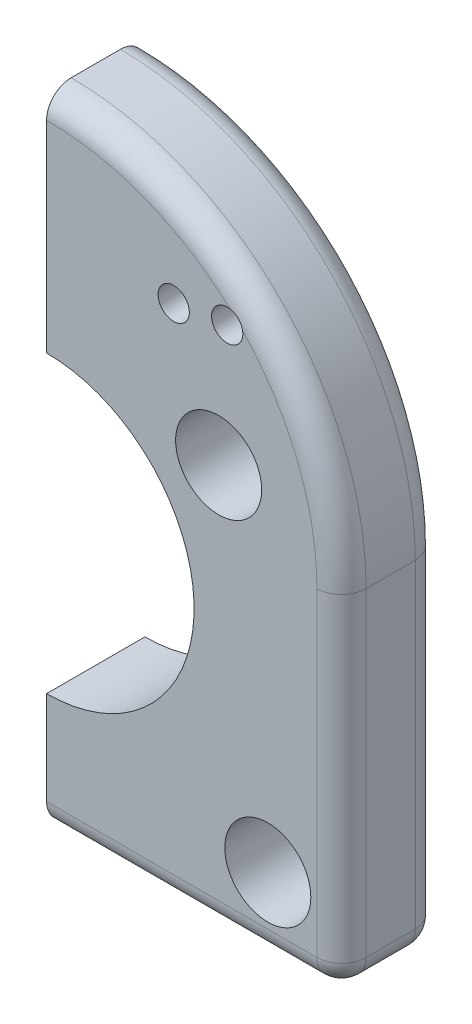
ISO-10303-21;
HEADER;
FILE_DESCRIPTION(('STEP AP214'),'2;1');
FILE_NAME('part.step','',(''),(''),'','','');
FILE_SCHEMA(('AUTOMOTIVE_DESIGN { 1 0 10303 214 1 1 1 1 }'));
ENDSEC;
DATA;
#1=APPLICATION_CONTEXT('core data for automotive mechanical design processes');
#2=APPLICATION_PROTOCOL_DEFINITION('international standard','automotive_design',2000,#1);
#3=PRODUCT_CONTEXT('',#1,'mechanical');
#4=PRODUCT('Part','Part','',(#3));
#5=PRODUCT_RELATED_PRODUCT_CATEGORY('part','',(#4));
#6=PRODUCT_DEFINITION_FORMATION('','',#4);
#7=PRODUCT_DEFINITION_CONTEXT('part definition',#1,'design');
#8=PRODUCT_DEFINITION('design','',#6,#7);
#9=PRODUCT_DEFINITION_SHAPE('','',#8);
#10=(LENGTH_UNIT() NAMED_UNIT(*) SI_UNIT(.MILLI.,.METRE.));
#11=(NAMED_UNIT(*) PLANE_ANGLE_UNIT() SI_UNIT($,.RADIAN.));
#12=(NAMED_UNIT(*) SI_UNIT($,.STERADIAN.) SOLID_ANGLE_UNIT());
#13=UNCERTAINTY_MEASURE_WITH_UNIT(LENGTH_MEASURE(1.E-05),#10,'distance_accuracy_value','');
#14=(GEOMETRIC_REPRESENTATION_CONTEXT(3) GLOBAL_UNCERTAINTY_ASSIGNED_CONTEXT((#13)) GLOBAL_UNIT_ASSIGNED_CONTEXT((#10,
#11,#12)) REPRESENTATION_CONTEXT('',''));
#15=CARTESIAN_POINT('',(0.,0.,0.));
#16=DIRECTION('',(0.,0.,1.));
#17=DIRECTION('',(1.,0.,0.));
#18=AXIS2_PLACEMENT_3D('',#15,#16,#17);
#19=CARTESIAN_POINT('',(-19.05,34.29,12.7));
#20=DIRECTION('',(0.,0.,1.));
#21=DIRECTION('',(1.,0.,0.));
#22=AXIS2_PLACEMENT_3D('',#19,#20,#21);
#23=PLANE('',#22);
#24=CARTESIAN_POINT('',(-2.63081274114402,67.0969348215972,12.7));
#25=DIRECTION('',(0.,0.,1.));
#26=DIRECTION('',(1.,0.,0.));
#27=AXIS2_PLACEMENT_3D('',#24,#25,#26);
#28=CIRCLE('',#27,2.01929999999999);
#29=CARTESIAN_POINT('',(-0.611512741144035,67.0969348215972,12.7));
#30=VERTEX_POINT('',#29);
#31=EDGE_CURVE('E159',#30,#30,#28,.T.);
#32=ORIENTED_EDGE('',*,*,#31,.F.);
#33=EDGE_LOOP('',(#32));
#34=FACE_BOUND('',#33,.T.);
#35=DIRECTION('',(0.,-1.,0.));
#36=VECTOR('',#35,1.);
#37=CARTESIAN_POINT('',(-19.05,0.,12.7));
#38=LINE('',#37,#36);
#39=CARTESIAN_POINT('',(-19.05,15.24,12.7));
#40=VERTEX_POINT('',#39);
#41=CARTESIAN_POINT('',(-19.05,3.175,12.7));
#42=VERTEX_POINT('',#41);
#43=EDGE_CURVE('E184',#40,#42,#38,.T.);
#44=ORIENTED_EDGE('',*,*,#43,.T.);
#45=DIRECTION('',(1.,0.,0.));
#46=VECTOR('',#45,1.);
#47=CARTESIAN_POINT('',(19.05,3.175,12.7));
#48=LINE('',#47,#46);
#49=CARTESIAN_POINT('',(15.875,3.175,12.7));
#50=VERTEX_POINT('',#49);
#51=EDGE_CURVE('E218',#42,#50,#48,.T.);
#52=ORIENTED_EDGE('',*,*,#51,.T.);
#53=DIRECTION('',(0.,1.,0.));
#54=VECTOR('',#53,1.);
#55=CARTESIAN_POINT('',(15.875,44.45,12.7));
#56=LINE('',#55,#54);
#57=CARTESIAN_POINT('',(15.875,44.45,12.7));
#58=VERTEX_POINT('',#57);
#59=EDGE_CURVE('E215',#50,#58,#56,.T.);
#60=ORIENTED_EDGE('',*,*,#59,.T.);
#61=CARTESIAN_POINT('',(-19.05,44.45,12.7));
#62=DIRECTION('',(0.,0.,1.));
#63=DIRECTION('',(1.,0.,0.));
#64=AXIS2_PLACEMENT_3D('',#61,#62,#63);
#65=CIRCLE('',#64,34.925);
#66=CARTESIAN_POINT('',(6.25945275928739,68.5163089406207,12.7));
#67=VERTEX_POINT('',#66);
#68=EDGE_CURVE('E213',#58,#67,#65,.T.);
#69=ORIENTED_EDGE('',*,*,#68,.T.);
#70=CARTESIAN_POINT('',(4.27710903744031,68.1317496364121,12.7));
#71=DIRECTION('',(0.,0.,1.));
#72=DIRECTION('',(1.,0.,0.));
#73=AXIS2_PLACEMENT_3D('',#70,#71,#72);
#74=CIRCLE('',#73,2.01929999999999);
#75=CARTESIAN_POINT('',(4.63171618424718,70.1196697206794,12.7));
#76=VERTEX_POINT('',#75);
#77=EDGE_CURVE('E165',#76,#67,#74,.T.);
#78=ORIENTED_EDGE('',*,*,#77,.F.);
#79=CARTESIAN_POINT('',(-19.05,44.45,12.7));
#80=DIRECTION('',(0.,0.,1.));
#81=DIRECTION('',(1.,0.,0.));
#82=AXIS2_PLACEMENT_3D('',#79,#80,#81);
#83=CIRCLE('',#82,34.925);
#84=CARTESIAN_POINT('',(-19.05,79.375,12.7));
#85=VERTEX_POINT('',#84);
#86=EDGE_CURVE('E211',#76,#85,#83,.T.);
#87=ORIENTED_EDGE('',*,*,#86,.T.);
#88=DIRECTION('',(0.,-1.,0.));
#89=VECTOR('',#88,1.);
#90=CARTESIAN_POINT('',(-19.05,53.34,12.7));
#91=LINE('',#90,#89);
#92=CARTESIAN_POINT('',(-19.05,53.34,12.7));
#93=VERTEX_POINT('',#92);
#94=EDGE_CURVE('E187',#85,#93,#91,.T.);
#95=ORIENTED_EDGE('',*,*,#94,.T.);
#96=CARTESIAN_POINT('',(-19.05,34.29,12.7));
#97=DIRECTION('',(0.,0.,-1.));
#98=DIRECTION('',(1.,0.,0.));
#99=AXIS2_PLACEMENT_3D('',#96,#97,#98);
#100=CIRCLE('',#99,19.05);
#101=EDGE_CURVE('E190',#93,#40,#100,.T.);
#102=ORIENTED_EDGE('',*,*,#101,.T.);
#103=EDGE_LOOP('',(#44,#52,#60,#69,#78,#87,#95,#102));
#104=FACE_BOUND('',#103,.T.);
#105=CARTESIAN_POINT('',(9.525,9.525,12.7));
#106=DIRECTION('',(0.,0.,1.));
#107=DIRECTION('',(1.,0.,0.));
#108=AXIS2_PLACEMENT_3D('',#105,#106,#107);
#109=CIRCLE('',#108,5.55625000000001);
#110=CARTESIAN_POINT('',(15.08125,9.525,12.7));
#111=VERTEX_POINT('',#110);
#112=EDGE_CURVE('E178',#111,#111,#109,.T.);
#113=ORIENTED_EDGE('',*,*,#112,.F.);
#114=EDGE_LOOP('',(#113));
#115=FACE_BOUND('',#114,.T.);
#116=CARTESIAN_POINT('',(3.175,51.9145200049493,12.7));
#117=DIRECTION('',(0.,0.,1.));
#118=DIRECTION('',(1.,0.,0.));
#119=AXIS2_PLACEMENT_3D('',#116,#117,#118);
#120=CIRCLE('',#119,5.55625);
#121=CARTESIAN_POINT('',(8.73125,51.9145200049493,12.7));
#122=VERTEX_POINT('',#121);
#123=EDGE_CURVE('E172',#122,#122,#120,.T.);
#124=ORIENTED_EDGE('',*,*,#123,.F.);
#125=EDGE_LOOP('',(#124));
#126=FACE_BOUND('',#125,.T.);
#127=ADVANCED_FACE('F37',(#34,#104,#115,#126),#23,.T.);
#128=CARTESIAN_POINT('',(-19.05,34.29,0.));
#129=DIRECTION('',(0.,0.,1.));
#130=DIRECTION('',(1.,0.,0.));
#131=AXIS2_PLACEMENT_3D('',#128,#129,#130);
#132=PLANE('',#131);
#133=CARTESIAN_POINT('',(-2.63081274114402,67.0969348215972,0.));
#134=DIRECTION('',(0.,0.,1.));
#135=DIRECTION('',(1.,0.,0.));
#136=AXIS2_PLACEMENT_3D('',#133,#134,#135);
#137=CIRCLE('',#136,2.0193);
#138=CARTESIAN_POINT('',(-0.611512741144027,67.0969348215972,0.));
#139=VERTEX_POINT('',#138);
#140=EDGE_CURVE('E162',#139,#139,#137,.T.);
#141=ORIENTED_EDGE('',*,*,#140,.T.);
#142=EDGE_LOOP('',(#141));
#143=FACE_BOUND('',#142,.T.);
#144=DIRECTION('',(0.,-1.,0.));
#145=VECTOR('',#144,1.);
#146=CARTESIAN_POINT('',(-19.05,53.34,0.));
#147=LINE('',#146,#145);
#148=CARTESIAN_POINT('',(-19.05,79.375,0.));
#149=VERTEX_POINT('',#148);
#150=CARTESIAN_POINT('',(-19.05,53.34,0.));
#151=VERTEX_POINT('',#150);
#152=EDGE_CURVE('E195',#149,#151,#147,.T.);
#153=ORIENTED_EDGE('',*,*,#152,.F.);
#154=CARTESIAN_POINT('',(-19.05,44.45,0.));
#155=DIRECTION('',(0.,0.,1.));
#156=DIRECTION('',(1.,0.,0.));
#157=AXIS2_PLACEMENT_3D('',#154,#155,#156);
#158=CIRCLE('',#157,34.925);
#159=CARTESIAN_POINT('',(4.63171618424717,70.1196697206794,0.));
#160=VERTEX_POINT('',#159);
#161=EDGE_CURVE('E240',#149,#160,#158,.F.);
#162=ORIENTED_EDGE('',*,*,#161,.T.);
#163=CARTESIAN_POINT('',(4.27710903744031,68.1317496364121,0.));
#164=DIRECTION('',(0.,0.,1.));
#165=DIRECTION('',(1.,0.,0.));
#166=AXIS2_PLACEMENT_3D('',#163,#164,#165);
#167=CIRCLE('',#166,2.0193);
#168=CARTESIAN_POINT('',(6.2594527592874,68.5163089406207,0.));
#169=VERTEX_POINT('',#168);
#170=EDGE_CURVE('E168',#160,#169,#167,.T.);
#171=ORIENTED_EDGE('',*,*,#170,.T.);
#172=CARTESIAN_POINT('',(-19.05,44.45,0.));
#173=DIRECTION('',(0.,0.,1.));
#174=DIRECTION('',(1.,0.,0.));
#175=AXIS2_PLACEMENT_3D('',#172,#173,#174);
#176=CIRCLE('',#175,34.925);
#177=CARTESIAN_POINT('',(15.875,44.45,0.));
#178=VERTEX_POINT('',#177);
#179=EDGE_CURVE('E238',#169,#178,#176,.F.);
#180=ORIENTED_EDGE('',*,*,#179,.T.);
#181=DIRECTION('',(0.,1.,0.));
#182=VECTOR('',#181,1.);
#183=CARTESIAN_POINT('',(15.875,34.29,0.));
#184=LINE('',#183,#182);
#185=CARTESIAN_POINT('',(15.875,3.175,0.));
#186=VERTEX_POINT('',#185);
#187=EDGE_CURVE('E234',#178,#186,#184,.F.);
#188=ORIENTED_EDGE('',*,*,#187,.T.);
#189=DIRECTION('',(1.,0.,0.));
#190=VECTOR('',#189,1.);
#191=CARTESIAN_POINT('',(-19.05,3.175,0.));
#192=LINE('',#191,#190);
#193=CARTESIAN_POINT('',(-19.05,3.175,0.));
#194=VERTEX_POINT('',#193);
#195=EDGE_CURVE('E236',#186,#194,#192,.F.);
#196=ORIENTED_EDGE('',*,*,#195,.T.);
#197=DIRECTION('',(0.,-1.,0.));
#198=VECTOR('',#197,1.);
#199=CARTESIAN_POINT('',(-19.05,0.,0.));
#200=LINE('',#199,#198);
#201=CARTESIAN_POINT('',(-19.05,15.24,0.));
#202=VERTEX_POINT('',#201);
#203=EDGE_CURVE('E181',#202,#194,#200,.T.);
#204=ORIENTED_EDGE('',*,*,#203,.F.);
#205=CARTESIAN_POINT('',(-19.05,34.29,0.));
#206=DIRECTION('',(0.,0.,-1.));
#207=DIRECTION('',(1.,0.,0.));
#208=AXIS2_PLACEMENT_3D('',#205,#206,#207);
#209=CIRCLE('',#208,19.05);
#210=EDGE_CURVE('E188',#151,#202,#209,.T.);
#211=ORIENTED_EDGE('',*,*,#210,.F.);
#212=EDGE_LOOP('',(#153,#162,#171,#180,#188,#196,#204,#211));
#213=FACE_BOUND('',#212,.T.);
#214=CARTESIAN_POINT('',(9.525,9.525,0.));
#215=DIRECTION('',(0.,0.,1.));
#216=DIRECTION('',(1.,0.,0.));
#217=AXIS2_PLACEMENT_3D('',#214,#215,#216);
#218=CIRCLE('',#217,5.55625000000001);
#219=CARTESIAN_POINT('',(15.08125,9.525,0.));
#220=VERTEX_POINT('',#219);
#221=EDGE_CURVE('E175',#220,#220,#218,.T.);
#222=ORIENTED_EDGE('',*,*,#221,.T.);
#223=EDGE_LOOP('',(#222));
#224=FACE_BOUND('',#223,.T.);
#225=CARTESIAN_POINT('',(3.175,51.9145200049493,0.));
#226=DIRECTION('',(0.,0.,1.));
#227=DIRECTION('',(1.,0.,0.));
#228=AXIS2_PLACEMENT_3D('',#225,#226,#227);
#229=CIRCLE('',#228,5.55625);
#230=CARTESIAN_POINT('',(8.73125,51.9145200049493,0.));
#231=VERTEX_POINT('',#230);
#232=EDGE_CURVE('E171',#231,#231,#229,.T.);
#233=ORIENTED_EDGE('',*,*,#232,.T.);
#234=EDGE_LOOP('',(#233));
#235=FACE_BOUND('',#234,.T.);
#236=ADVANCED_FACE('F278',(#143,#213,#224,#235),#132,.F.);
#237=CARTESIAN_POINT('',(-19.05,0.,12.7));
#238=DIRECTION('',(1.,0.,0.));
#239=DIRECTION('',(0.,0.,-1.));
#240=AXIS2_PLACEMENT_3D('',#237,#238,#239);
#241=PLANE('',#240);
#242=CARTESIAN_POINT('',(-19.05,7.62,6.35));
#243=DIRECTION('',(-1.,0.,0.));
#244=DIRECTION('',(0.,0.,1.));
#245=AXIS2_PLACEMENT_3D('',#242,#243,#244);
#246=CIRCLE('',#245,2.01929999999999);
#247=CARTESIAN_POINT('',(-19.05,7.62,8.36929999999999));
#248=VERTEX_POINT('',#247);
#249=EDGE_CURVE('E149',#248,#248,#246,.T.);
#250=ORIENTED_EDGE('',*,*,#249,.F.);
#251=EDGE_LOOP('',(#250));
#252=FACE_BOUND('',#251,.T.);
#253=ORIENTED_EDGE('',*,*,#203,.T.);
#254=CARTESIAN_POINT('',(-19.05,3.175,3.175));
#255=DIRECTION('',(1.,0.,0.));
#256=DIRECTION('',(0.,0.,-1.));
#257=AXIS2_PLACEMENT_3D('',#254,#255,#256);
#258=CIRCLE('',#257,3.175);
#259=CARTESIAN_POINT('',(-19.05,0.,3.175));
#260=VERTEX_POINT('',#259);
#261=EDGE_CURVE('E11',#194,#260,#258,.F.);
#262=ORIENTED_EDGE('',*,*,#261,.T.);
#263=DIRECTION('',(0.,0.,-1.));
#264=VECTOR('',#263,1.);
#265=CARTESIAN_POINT('',(-19.05,0.,12.7));
#266=LINE('',#265,#264);
#267=CARTESIAN_POINT('',(-19.05,0.,9.525));
#268=VERTEX_POINT('',#267);
#269=EDGE_CURVE('E209',#268,#260,#266,.T.);
#270=ORIENTED_EDGE('',*,*,#269,.F.);
#271=CARTESIAN_POINT('',(-19.05,3.175,9.525));
#272=DIRECTION('',(1.,0.,0.));
#273=DIRECTION('',(0.,0.,-1.));
#274=AXIS2_PLACEMENT_3D('',#271,#272,#273);
#275=CIRCLE('',#274,3.175);
#276=EDGE_CURVE('E47',#268,#42,#275,.F.);
#277=ORIENTED_EDGE('',*,*,#276,.T.);
#278=ORIENTED_EDGE('',*,*,#43,.F.);
#279=DIRECTION('',(0.,0.,-1.));
#280=VECTOR('',#279,1.);
#281=CARTESIAN_POINT('',(-19.05,15.24,12.7));
#282=LINE('',#281,#280);
#283=EDGE_CURVE('E192',#40,#202,#282,.T.);
#284=ORIENTED_EDGE('',*,*,#283,.T.);
#285=EDGE_LOOP('',(#253,#262,#270,#277,#278,#284));
#286=FACE_BOUND('',#285,.T.);
#287=ADVANCED_FACE('F282',(#252,#286),#241,.F.);
#288=CARTESIAN_POINT('',(-19.05,0.,12.7));
#289=DIRECTION('',(0.,1.,0.));
#290=DIRECTION('',(-1.,0.,0.));
#291=AXIS2_PLACEMENT_3D('',#288,#289,#290);
#292=PLANE('',#291);
#293=ORIENTED_EDGE('',*,*,#269,.T.);
#294=DIRECTION('',(1.,0.,0.));
#295=VECTOR('',#294,1.);
#296=CARTESIAN_POINT('',(-19.05,0.,3.175));
#297=LINE('',#296,#295);
#298=CARTESIAN_POINT('',(15.875,0.,3.175));
#299=VERTEX_POINT('',#298);
#300=EDGE_CURVE('E60',#260,#299,#297,.T.);
#301=ORIENTED_EDGE('',*,*,#300,.T.);
#302=DIRECTION('',(0.,0.,-1.));
#303=VECTOR('',#302,1.);
#304=CARTESIAN_POINT('',(15.875,0.,12.7));
#305=LINE('',#304,#303);
#306=CARTESIAN_POINT('',(15.875,0.,9.525));
#307=VERTEX_POINT('',#306);
#308=EDGE_CURVE('E55',#299,#307,#305,.F.);
#309=ORIENTED_EDGE('',*,*,#308,.T.);
#310=DIRECTION('',(1.,0.,0.));
#311=VECTOR('',#310,1.);
#312=CARTESIAN_POINT('',(-19.05,0.,9.525));
#313=LINE('',#312,#311);
#314=EDGE_CURVE('E371',#307,#268,#313,.F.);
#315=ORIENTED_EDGE('',*,*,#314,.T.);
#316=EDGE_LOOP('',(#293,#301,#309,#315));
#317=FACE_BOUND('',#316,.T.);
#318=ADVANCED_FACE('F298',(#317),#292,.F.);
#319=CARTESIAN_POINT('',(19.05,0.,12.7));
#320=DIRECTION('',(-1.,0.,0.));
#321=DIRECTION('',(0.,-1.,0.));
#322=AXIS2_PLACEMENT_3D('',#319,#320,#321);
#323=PLANE('',#322);
#324=DIRECTION('',(0.,0.,-1.));
#325=VECTOR('',#324,1.);
#326=CARTESIAN_POINT('',(19.05,44.45,12.7));
#327=LINE('',#326,#325);
#328=CARTESIAN_POINT('',(19.05,44.45,9.525));
#329=VERTEX_POINT('',#328);
#330=CARTESIAN_POINT('',(19.05,44.45,3.175));
#331=VERTEX_POINT('',#330);
#332=EDGE_CURVE('E206',#329,#331,#327,.T.);
#333=ORIENTED_EDGE('',*,*,#332,.F.);
#334=DIRECTION('',(0.,1.,0.));
#335=VECTOR('',#334,1.);
#336=CARTESIAN_POINT('',(19.05,0.,9.525));
#337=LINE('',#336,#335);
#338=CARTESIAN_POINT('',(19.05,3.175,9.525));
#339=VERTEX_POINT('',#338);
#340=EDGE_CURVE('E224',#329,#339,#337,.F.);
#341=ORIENTED_EDGE('',*,*,#340,.T.);
#342=DIRECTION('',(0.,0.,-1.));
#343=VECTOR('',#342,1.);
#344=CARTESIAN_POINT('',(19.05,3.175,12.7));
#345=LINE('',#344,#343);
#346=CARTESIAN_POINT('',(19.05,3.175,3.175));
#347=VERTEX_POINT('',#346);
#348=EDGE_CURVE('E222',#339,#347,#345,.T.);
#349=ORIENTED_EDGE('',*,*,#348,.T.);
#350=DIRECTION('',(0.,1.,0.));
#351=VECTOR('',#350,1.);
#352=CARTESIAN_POINT('',(19.05,0.,3.175));
#353=LINE('',#352,#351);
#354=EDGE_CURVE('E220',#347,#331,#353,.T.);
#355=ORIENTED_EDGE('',*,*,#354,.T.);
#356=EDGE_LOOP('',(#333,#341,#349,#355));
#357=FACE_BOUND('',#356,.T.);
#358=ADVANCED_FACE('F294',(#357),#323,.F.);
#359=CARTESIAN_POINT('',(-19.05,44.45,12.7));
#360=DIRECTION('',(0.,0.,-1.));
#361=DIRECTION('',(-1.,0.,0.));
#362=AXIS2_PLACEMENT_3D('',#359,#360,#361);
#363=CYLINDRICAL_SURFACE('',#362,38.1);
#364=ORIENTED_EDGE('',*,*,#332,.T.);
#365=CARTESIAN_POINT('',(-19.05,44.45,3.175));
#366=DIRECTION('',(0.,0.,1.));
#367=DIRECTION('',(1.,0.,0.));
#368=AXIS2_PLACEMENT_3D('',#365,#366,#367);
#369=CIRCLE('',#368,38.1);
#370=CARTESIAN_POINT('',(-19.05,82.55,3.175));
#371=VERTEX_POINT('',#370);
#372=EDGE_CURVE('E228',#331,#371,#369,.T.);
#373=ORIENTED_EDGE('',*,*,#372,.T.);
#374=DIRECTION('',(0.,0.,-1.));
#375=VECTOR('',#374,1.);
#376=CARTESIAN_POINT('',(-19.05,82.55,12.7));
#377=LINE('',#376,#375);
#378=CARTESIAN_POINT('',(-19.05,82.55,9.525));
#379=VERTEX_POINT('',#378);
#380=EDGE_CURVE('E203',#379,#371,#377,.T.);
#381=ORIENTED_EDGE('',*,*,#380,.F.);
#382=CARTESIAN_POINT('',(-19.05,44.45,9.525));
#383=DIRECTION('',(0.,0.,1.));
#384=DIRECTION('',(1.,0.,0.));
#385=AXIS2_PLACEMENT_3D('',#382,#383,#384);
#386=CIRCLE('',#385,38.1);
#387=EDGE_CURVE('E226',#379,#329,#386,.F.);
#388=ORIENTED_EDGE('',*,*,#387,.T.);
#389=EDGE_LOOP('',(#364,#373,#381,#388));
#390=FACE_BOUND('',#389,.T.);
#391=ADVANCED_FACE('F290',(#390),#363,.T.);
#392=CARTESIAN_POINT('',(-19.05,53.34,12.7));
#393=DIRECTION('',(1.,0.,0.));
#394=DIRECTION('',(0.,0.,-1.));
#395=AXIS2_PLACEMENT_3D('',#392,#393,#394);
#396=PLANE('',#395);
#397=CARTESIAN_POINT('',(-19.05,60.96,6.35));
#398=DIRECTION('',(-1.,0.,0.));
#399=DIRECTION('',(0.,0.,1.));
#400=AXIS2_PLACEMENT_3D('',#397,#398,#399);
#401=CIRCLE('',#400,2.01929999999999);
#402=CARTESIAN_POINT('',(-19.05,60.96,8.36929999999999));
#403=VERTEX_POINT('',#402);
#404=EDGE_CURVE('E148',#403,#403,#401,.T.);
#405=ORIENTED_EDGE('',*,*,#404,.F.);
#406=EDGE_LOOP('',(#405));
#407=FACE_BOUND('',#406,.T.);
#408=ORIENTED_EDGE('',*,*,#380,.T.);
#409=CARTESIAN_POINT('',(-19.05,79.375,3.175));
#410=DIRECTION('',(1.,0.,0.));
#411=DIRECTION('',(0.,0.,-1.));
#412=AXIS2_PLACEMENT_3D('',#409,#410,#411);
#413=CIRCLE('',#412,3.175);
#414=EDGE_CURVE('E232',#371,#149,#413,.F.);
#415=ORIENTED_EDGE('',*,*,#414,.T.);
#416=ORIENTED_EDGE('',*,*,#152,.T.);
#417=DIRECTION('',(0.,0.,-1.));
#418=VECTOR('',#417,1.);
#419=CARTESIAN_POINT('',(-19.05,53.34,12.7));
#420=LINE('',#419,#418);
#421=EDGE_CURVE('E200',#93,#151,#420,.T.);
#422=ORIENTED_EDGE('',*,*,#421,.F.);
#423=ORIENTED_EDGE('',*,*,#94,.F.);
#424=CARTESIAN_POINT('',(-19.05,79.375,9.525));
#425=DIRECTION('',(1.,0.,0.));
#426=DIRECTION('',(0.,0.,-1.));
#427=AXIS2_PLACEMENT_3D('',#424,#425,#426);
#428=CIRCLE('',#427,3.175);
#429=EDGE_CURVE('E230',#85,#379,#428,.F.);
#430=ORIENTED_EDGE('',*,*,#429,.T.);
#431=EDGE_LOOP('',(#408,#415,#416,#422,#423,#430));
#432=FACE_BOUND('',#431,.T.);
#433=ADVANCED_FACE('F286',(#407,#432),#396,.F.);
#434=CARTESIAN_POINT('',(-19.05,34.29,12.7));
#435=DIRECTION('',(0.,0.,-1.));
#436=DIRECTION('',(-1.,0.,0.));
#437=AXIS2_PLACEMENT_3D('',#434,#435,#436);
#438=CYLINDRICAL_SURFACE('',#437,19.05);
#439=ORIENTED_EDGE('',*,*,#210,.T.);
#440=ORIENTED_EDGE('',*,*,#283,.F.);
#441=ORIENTED_EDGE('',*,*,#101,.F.);
#442=ORIENTED_EDGE('',*,*,#421,.T.);
#443=EDGE_LOOP('',(#439,#440,#441,#442));
#444=FACE_BOUND('',#443,.T.);
#445=ADVANCED_FACE('F274',(#444),#438,.F.);
#446=CARTESIAN_POINT('',(9.525,9.525,12.7));
#447=DIRECTION('',(0.,0.,-1.));
#448=DIRECTION('',(-1.,0.,0.));
#449=AXIS2_PLACEMENT_3D('',#446,#447,#448);
#450=CYLINDRICAL_SURFACE('',#449,5.55625000000001);
#451=ORIENTED_EDGE('',*,*,#112,.T.);
#452=EDGE_LOOP('',(#451));
#453=FACE_BOUND('',#452,.T.);
#454=ORIENTED_EDGE('',*,*,#221,.F.);
#455=EDGE_LOOP('',(#454));
#456=FACE_BOUND('',#455,.T.);
#457=ADVANCED_FACE('F270',(#453,#456),#450,.F.);
#458=CARTESIAN_POINT('',(3.175,51.9145200049493,12.7));
#459=DIRECTION('',(0.,0.,-1.));
#460=DIRECTION('',(-1.,0.,0.));
#461=AXIS2_PLACEMENT_3D('',#458,#459,#460);
#462=CYLINDRICAL_SURFACE('',#461,5.55625);
#463=ORIENTED_EDGE('',*,*,#123,.T.);
#464=EDGE_LOOP('',(#463));
#465=FACE_BOUND('',#464,.T.);
#466=ORIENTED_EDGE('',*,*,#232,.F.);
#467=EDGE_LOOP('',(#466));
#468=FACE_BOUND('',#467,.T.);
#469=ADVANCED_FACE('F264',(#465,#468),#462,.F.);
#470=CARTESIAN_POINT('',(4.27710903744031,68.1317496364121,12.7));
#471=DIRECTION('',(0.,0.,1.));
#472=DIRECTION('',(1.,0.,0.));
#473=AXIS2_PLACEMENT_3D('',#470,#471,#472);
#474=CYLINDRICAL_SURFACE('',#473,2.01929999999999);
#475=ORIENTED_EDGE('',*,*,#170,.F.);
#476=CARTESIAN_POINT('',(4.63171618424717,70.1196697206794,0.));
#477=CARTESIAN_POINT('',(4.68758846947112,70.1097028806535,3.75708084744664E-06));
#478=CARTESIAN_POINT('',(4.74301002867299,70.0973850975203,0.000440559022219978));
#479=CARTESIAN_POINT('',(4.85260883373584,70.0681360049592,0.00187873139372369));
#480=CARTESIAN_POINT('',(4.90678620908427,70.0512051780112,0.00288004279331596));
#481=CARTESIAN_POINT('',(5.06680778740178,69.9936748033854,0.00627560782444844));
#482=CARTESIAN_POINT('',(5.17029766396141,69.9463093269964,0.00906316925784902));
#483=CARTESIAN_POINT('',(5.36786745678461,69.8348943239468,0.0138276405408528));
#484=CARTESIAN_POINT('',(5.46194429455076,69.7708393635799,0.0158042858344865));
#485=CARTESIAN_POINT('',(5.63803176278236,69.6278483023512,0.0179206778451322));
#486=CARTESIAN_POINT('',(5.72004503821385,69.5489154721839,0.0180608278136659));
#487=CARTESIAN_POINT('',(5.86950094190356,69.3786172989156,0.0164389934416785));
#488=CARTESIAN_POINT('',(5.93697318017117,69.287277850219,0.0146809192220565));
#489=CARTESIAN_POINT('',(6.05565888220445,69.0946168596295,0.0101618891902027));
#490=CARTESIAN_POINT('',(6.10688013035784,68.9933001275254,0.00740141490078933));
#491=CARTESIAN_POINT('',(6.17356105071743,68.8283567967465,0.00363906839490178));
#492=CARTESIAN_POINT('',(6.1949582600873,68.7670698037085,0.00238910195887915));
#493=CARTESIAN_POINT('',(6.23173313878137,68.6428326837103,0.000574014271079536));
#494=CARTESIAN_POINT('',(6.24712210543913,68.579885917987,7.60348928051835E-06));
#495=CARTESIAN_POINT('',(6.2594527592874,68.5163089406207,0.));
#496=B_SPLINE_CURVE_WITH_KNOTS('',3,(#476,#477,#478,#479,#480,#481,#482,#483,#484,#485,#486,
#487,#488,#489,#490,#491,#492,#493,#494,#495),.UNSPECIFIED.,.F.,.F.,(4,2,2,2,2,2,2,2,2,4),(0.,
0.170151715917603,0.340285642434477,0.68008339676474,1.01999191985235,1.3598258057085,
1.69896100646438,2.03793351192316,2.2324406937287,2.4265803605948),.UNSPECIFIED.);
#497=EDGE_CURVE('E249',#160,#169,#496,.T.);
#498=ORIENTED_EDGE('',*,*,#497,.T.);
#499=EDGE_LOOP('',(#475,#498));
#500=FACE_BOUND('',#499,.T.);
#501=ORIENTED_EDGE('',*,*,#77,.T.);
#502=CARTESIAN_POINT('',(6.25945275928739,68.5163089406207,12.7));
#503=CARTESIAN_POINT('',(6.24864408692135,68.5720244928295,12.6999962429192));
#504=CARTESIAN_POINT('',(6.23549153931277,68.6272539007304,12.6995594409778));
#505=CARTESIAN_POINT('',(6.20459221635413,68.7363989387649,12.6981212686063));
#506=CARTESIAN_POINT('',(6.1868459214754,68.7903147056505,12.6971199572067));
#507=CARTESIAN_POINT('',(6.12690778757657,68.9494500871235,12.6937243921756));
#508=CARTESIAN_POINT('',(6.07798631058383,69.05221356309,12.6909368307421));
#509=CARTESIAN_POINT('',(5.96360317703402,69.2480799070598,12.6861723594591));
#510=CARTESIAN_POINT('',(5.89813613383559,69.3411796149355,12.6841957141655));
#511=CARTESIAN_POINT('',(5.75250464826811,69.5150896792531,12.6820793221549));
#512=CARTESIAN_POINT('',(5.67234343631561,69.595902729706,12.6819391721863));
#513=CARTESIAN_POINT('',(5.49980974754842,69.7427722677547,12.6835610065583));
#514=CARTESIAN_POINT('',(5.40746271545328,69.8088587526684,12.6853190807779));
#515=CARTESIAN_POINT('',(5.21303299665863,69.9246241948846,12.6898381108098));
#516=CARTESIAN_POINT('',(5.11095500175453,69.9743110082559,12.6925985850992));
#517=CARTESIAN_POINT('',(4.94502440417094,70.0384957750937,12.6963609316051));
#518=CARTESIAN_POINT('',(4.88342155891223,70.0589658884418,12.6976108980411));
#519=CARTESIAN_POINT('',(4.75864374290119,70.0938621678984,12.6994259857289));
#520=CARTESIAN_POINT('',(4.69547196255589,70.1082996807668,12.6999923965107));
#521=CARTESIAN_POINT('',(4.63171618424719,70.1196697206794,12.7));
#522=B_SPLINE_CURVE_WITH_KNOTS('',3,(#502,#503,#504,#505,#506,#507,#508,#509,#510,#511,#512,
#513,#514,#515,#516,#517,#518,#519,#520,#521),.UNSPECIFIED.,.F.,.F.,(4,2,2,2,2,2,2,2,2,4),(0.,
0.170151715917602,0.340285642434472,0.680083396764737,1.01999191985234,1.35982580570849,
1.69896100646438,2.03793351192318,2.23244069372869,2.42658036059476),.UNSPECIFIED.);
#523=EDGE_CURVE('E242',#67,#76,#522,.T.);
#524=ORIENTED_EDGE('',*,*,#523,.T.);
#525=EDGE_LOOP('',(#501,#524));
#526=FACE_BOUND('',#525,.T.);
#527=ADVANCED_FACE('F258',(#500,#526),#474,.F.);
#528=CARTESIAN_POINT('',(-2.63081274114402,67.0969348215972,12.7));
#529=DIRECTION('',(0.,0.,1.));
#530=DIRECTION('',(1.,0.,0.));
#531=AXIS2_PLACEMENT_3D('',#528,#529,#530);
#532=CYLINDRICAL_SURFACE('',#531,2.01929999999999);
#533=ORIENTED_EDGE('',*,*,#140,.F.);
#534=EDGE_LOOP('',(#533));
#535=FACE_BOUND('',#534,.T.);
#536=ORIENTED_EDGE('',*,*,#31,.T.);
#537=EDGE_LOOP('',(#536));
#538=FACE_BOUND('',#537,.T.);
#539=ADVANCED_FACE('F263',(#535,#538),#532,.F.);
#540=CARTESIAN_POINT('',(-3.048,60.96,6.35));
#541=DIRECTION('',(-1.,0.,0.));
#542=DIRECTION('',(0.,0.,1.));
#543=AXIS2_PLACEMENT_3D('',#540,#541,#542);
#544=CONICAL_SURFACE('',#543,2.0193,1.02974425867665);
#545=CARTESIAN_POINT('',(-1.83468215199765,60.96,6.35));
#546=VERTEX_POINT('',#545);
#547=VERTEX_LOOP('',#546);
#548=FACE_BOUND('',#547,.T.);
#549=CARTESIAN_POINT('',(-3.048,60.96,6.35));
#550=DIRECTION('',(-1.,0.,0.));
#551=DIRECTION('',(0.,0.,1.));
#552=AXIS2_PLACEMENT_3D('',#549,#550,#551);
#553=CIRCLE('',#552,2.0193);
#554=CARTESIAN_POINT('',(-3.048,60.96,8.3693));
#555=VERTEX_POINT('',#554);
#556=EDGE_CURVE('E152',#555,#555,#553,.T.);
#557=ORIENTED_EDGE('',*,*,#556,.T.);
#558=EDGE_LOOP('',(#557));
#559=FACE_BOUND('',#558,.T.);
#560=ADVANCED_FACE('F413',(#548,#559),#544,.F.);
#561=CARTESIAN_POINT('',(-19.05,60.96,6.35));
#562=DIRECTION('',(-1.,0.,0.));
#563=DIRECTION('',(0.,0.,1.));
#564=AXIS2_PLACEMENT_3D('',#561,#562,#563);
#565=CYLINDRICAL_SURFACE('',#564,2.01929999999999);
#566=ORIENTED_EDGE('',*,*,#556,.F.);
#567=EDGE_LOOP('',(#566));
#568=FACE_BOUND('',#567,.T.);
#569=ORIENTED_EDGE('',*,*,#404,.T.);
#570=EDGE_LOOP('',(#569));
#571=FACE_BOUND('',#570,.T.);
#572=ADVANCED_FACE('F142',(#568,#571),#565,.F.);
#573=CARTESIAN_POINT('',(-3.048,7.62,6.35));
#574=DIRECTION('',(-1.,0.,0.));
#575=DIRECTION('',(0.,0.,1.));
#576=AXIS2_PLACEMENT_3D('',#573,#574,#575);
#577=CONICAL_SURFACE('',#576,2.0193,1.02974425867665);
#578=CARTESIAN_POINT('',(-1.83468215199765,7.62,6.35));
#579=VERTEX_POINT('',#578);
#580=VERTEX_LOOP('',#579);
#581=FACE_BOUND('',#580,.T.);
#582=CARTESIAN_POINT('',(-3.048,7.62,6.35));
#583=DIRECTION('',(-1.,0.,0.));
#584=DIRECTION('',(0.,0.,1.));
#585=AXIS2_PLACEMENT_3D('',#582,#583,#584);
#586=CIRCLE('',#585,2.0193);
#587=CARTESIAN_POINT('',(-3.048,7.62,8.3693));
#588=VERTEX_POINT('',#587);
#589=EDGE_CURVE('E146',#588,#588,#586,.T.);
#590=ORIENTED_EDGE('',*,*,#589,.T.);
#591=EDGE_LOOP('',(#590));
#592=FACE_BOUND('',#591,.T.);
#593=ADVANCED_FACE('F138',(#581,#592),#577,.F.);
#594=CARTESIAN_POINT('',(-19.05,7.62,6.35));
#595=DIRECTION('',(-1.,0.,0.));
#596=DIRECTION('',(0.,0.,1.));
#597=AXIS2_PLACEMENT_3D('',#594,#595,#596);
#598=CYLINDRICAL_SURFACE('',#597,2.01929999999999);
#599=ORIENTED_EDGE('',*,*,#589,.F.);
#600=EDGE_LOOP('',(#599));
#601=FACE_BOUND('',#600,.T.);
#602=ORIENTED_EDGE('',*,*,#249,.T.);
#603=EDGE_LOOP('',(#602));
#604=FACE_BOUND('',#603,.T.);
#605=ADVANCED_FACE('F141',(#601,#604),#598,.F.);
#606=CARTESIAN_POINT('',(-19.05,44.45,3.175));
#607=DIRECTION('',(0.,0.,1.));
#608=DIRECTION('',(1.,0.,0.));
#609=AXIS2_PLACEMENT_3D('',#606,#607,#608);
#610=TOROIDAL_SURFACE('',#609,34.925,3.175);
#611=ORIENTED_EDGE('',*,*,#414,.F.);
#612=ORIENTED_EDGE('',*,*,#372,.F.);
#613=CARTESIAN_POINT('',(15.875,44.45,3.175));
#614=DIRECTION('',(0.,-1.,0.));
#615=DIRECTION('',(0.,0.,-1.));
#616=AXIS2_PLACEMENT_3D('',#613,#614,#615);
#617=CIRCLE('',#616,3.175);
#618=EDGE_CURVE('E42',#178,#331,#617,.T.);
#619=ORIENTED_EDGE('',*,*,#618,.F.);
#620=ORIENTED_EDGE('',*,*,#179,.F.);
#621=ORIENTED_EDGE('',*,*,#497,.F.);
#622=ORIENTED_EDGE('',*,*,#161,.F.);
#623=EDGE_LOOP('',(#611,#612,#619,#620,#621,#622));
#624=FACE_BOUND('',#623,.T.);
#625=ADVANCED_FACE('F39',(#624),#610,.T.);
#626=CARTESIAN_POINT('',(15.875,0.,3.175));
#627=DIRECTION('',(0.,1.,0.));
#628=DIRECTION('',(-1.,0.,0.));
#629=AXIS2_PLACEMENT_3D('',#626,#627,#628);
#630=CYLINDRICAL_SURFACE('',#629,3.175);
#631=ORIENTED_EDGE('',*,*,#618,.T.);
#632=ORIENTED_EDGE('',*,*,#354,.F.);
#633=CARTESIAN_POINT('',(15.875,3.175,3.175));
#634=DIRECTION('',(0.,-1.,0.));
#635=DIRECTION('',(1.,0.,0.));
#636=AXIS2_PLACEMENT_3D('',#633,#634,#635);
#637=CIRCLE('',#636,3.175);
#638=EDGE_CURVE('E334',#186,#347,#637,.T.);
#639=ORIENTED_EDGE('',*,*,#638,.F.);
#640=ORIENTED_EDGE('',*,*,#187,.F.);
#641=EDGE_LOOP('',(#631,#632,#639,#640));
#642=FACE_BOUND('',#641,.T.);
#643=ADVANCED_FACE('F344',(#642),#630,.T.);
#644=CARTESIAN_POINT('',(-19.05,3.175,3.175));
#645=DIRECTION('',(1.,0.,0.));
#646=DIRECTION('',(0.,1.,0.));
#647=AXIS2_PLACEMENT_3D('',#644,#645,#646);
#648=CYLINDRICAL_SURFACE('',#647,3.175);
#649=ORIENTED_EDGE('',*,*,#261,.F.);
#650=ORIENTED_EDGE('',*,*,#195,.F.);
#651=CARTESIAN_POINT('',(15.875,3.175,3.175));
#652=DIRECTION('',(1.,0.,0.));
#653=DIRECTION('',(0.,0.,-1.));
#654=AXIS2_PLACEMENT_3D('',#651,#652,#653);
#655=CIRCLE('',#654,3.175);
#656=EDGE_CURVE('E332',#299,#186,#655,.T.);
#657=ORIENTED_EDGE('',*,*,#656,.F.);
#658=ORIENTED_EDGE('',*,*,#300,.F.);
#659=EDGE_LOOP('',(#649,#650,#657,#658));
#660=FACE_BOUND('',#659,.T.);
#661=ADVANCED_FACE('F389',(#660),#648,.T.);
#662=CARTESIAN_POINT('',(15.875,3.175,3.175));
#663=DIRECTION('',(0.,0.,1.));
#664=DIRECTION('',(1.,0.,0.));
#665=AXIS2_PLACEMENT_3D('',#662,#663,#664);
#666=SPHERICAL_SURFACE('',#665,3.175);
#667=ORIENTED_EDGE('',*,*,#656,.T.);
#668=ORIENTED_EDGE('',*,*,#638,.T.);
#669=CARTESIAN_POINT('',(15.875,3.175,3.175));
#670=DIRECTION('',(0.,0.,-1.));
#671=DIRECTION('',(-1.,0.,0.));
#672=AXIS2_PLACEMENT_3D('',#669,#670,#671);
#673=CIRCLE('',#672,3.175);
#674=EDGE_CURVE('E329',#299,#347,#673,.F.);
#675=ORIENTED_EDGE('',*,*,#674,.F.);
#676=EDGE_LOOP('',(#667,#668,#675));
#677=FACE_BOUND('',#676,.T.);
#678=ADVANCED_FACE('F390',(#677),#666,.T.);
#679=CARTESIAN_POINT('',(15.875,3.175,12.7));
#680=DIRECTION('',(0.,0.,-1.));
#681=DIRECTION('',(-1.,0.,0.));
#682=AXIS2_PLACEMENT_3D('',#679,#680,#681);
#683=CYLINDRICAL_SURFACE('',#682,3.175);
#684=ORIENTED_EDGE('',*,*,#674,.T.);
#685=ORIENTED_EDGE('',*,*,#348,.F.);
#686=CARTESIAN_POINT('',(15.875,3.175,9.525));
#687=DIRECTION('',(0.,0.,1.));
#688=DIRECTION('',(1.,0.,0.));
#689=AXIS2_PLACEMENT_3D('',#686,#687,#688);
#690=CIRCLE('',#689,3.175);
#691=EDGE_CURVE('E324',#307,#339,#690,.T.);
#692=ORIENTED_EDGE('',*,*,#691,.F.);
#693=ORIENTED_EDGE('',*,*,#308,.F.);
#694=EDGE_LOOP('',(#684,#685,#692,#693));
#695=FACE_BOUND('',#694,.T.);
#696=ADVANCED_FACE('F365',(#695),#683,.T.);
#697=CARTESIAN_POINT('',(-19.05,3.175,9.525));
#698=DIRECTION('',(-1.,0.,0.));
#699=DIRECTION('',(0.,-1.,0.));
#700=AXIS2_PLACEMENT_3D('',#697,#698,#699);
#701=CYLINDRICAL_SURFACE('',#700,3.175);
#702=ORIENTED_EDGE('',*,*,#276,.F.);
#703=ORIENTED_EDGE('',*,*,#314,.F.);
#704=CARTESIAN_POINT('',(15.875,3.175,9.525));
#705=DIRECTION('',(1.,0.,0.));
#706=DIRECTION('',(0.,0.,-1.));
#707=AXIS2_PLACEMENT_3D('',#704,#705,#706);
#708=CIRCLE('',#707,3.175);
#709=EDGE_CURVE('E321',#50,#307,#708,.T.);
#710=ORIENTED_EDGE('',*,*,#709,.F.);
#711=ORIENTED_EDGE('',*,*,#51,.F.);
#712=EDGE_LOOP('',(#702,#703,#710,#711));
#713=FACE_BOUND('',#712,.T.);
#714=ADVANCED_FACE('F370',(#713),#701,.T.);
#715=CARTESIAN_POINT('',(15.875,3.175,9.525));
#716=DIRECTION('',(0.,0.,1.));
#717=DIRECTION('',(1.,0.,0.));
#718=AXIS2_PLACEMENT_3D('',#715,#716,#717);
#719=SPHERICAL_SURFACE('',#718,3.175);
#720=ORIENTED_EDGE('',*,*,#709,.T.);
#721=ORIENTED_EDGE('',*,*,#691,.T.);
#722=CARTESIAN_POINT('',(15.875,3.175,9.525));
#723=DIRECTION('',(0.,-1.,0.));
#724=DIRECTION('',(0.,0.,-1.));
#725=AXIS2_PLACEMENT_3D('',#722,#723,#724);
#726=CIRCLE('',#725,3.175);
#727=EDGE_CURVE('E316',#50,#339,#726,.F.);
#728=ORIENTED_EDGE('',*,*,#727,.F.);
#729=EDGE_LOOP('',(#720,#721,#728));
#730=FACE_BOUND('',#729,.T.);
#731=ADVANCED_FACE('F310',(#730),#719,.T.);
#732=CARTESIAN_POINT('',(-19.05,44.45,9.525));
#733=DIRECTION('',(0.,0.,1.));
#734=DIRECTION('',(1.,0.,0.));
#735=AXIS2_PLACEMENT_3D('',#732,#733,#734);
#736=TOROIDAL_SURFACE('',#735,34.925,3.175);
#737=ORIENTED_EDGE('',*,*,#523,.F.);
#738=ORIENTED_EDGE('',*,*,#68,.F.);
#739=CARTESIAN_POINT('',(15.875,44.45,9.525));
#740=DIRECTION('',(0.,-1.,0.));
#741=DIRECTION('',(0.,0.,-1.));
#742=AXIS2_PLACEMENT_3D('',#739,#740,#741);
#743=CIRCLE('',#742,3.175);
#744=EDGE_CURVE('E322',#329,#58,#743,.T.);
#745=ORIENTED_EDGE('',*,*,#744,.F.);
#746=ORIENTED_EDGE('',*,*,#387,.F.);
#747=ORIENTED_EDGE('',*,*,#429,.F.);
#748=ORIENTED_EDGE('',*,*,#86,.F.);
#749=EDGE_LOOP('',(#737,#738,#745,#746,#747,#748));
#750=FACE_BOUND('',#749,.T.);
#751=ADVANCED_FACE('F254',(#750),#736,.T.);
#752=CARTESIAN_POINT('',(15.875,34.29,9.525));
#753=DIRECTION('',(0.,-1.,0.));
#754=DIRECTION('',(1.,0.,0.));
#755=AXIS2_PLACEMENT_3D('',#752,#753,#754);
#756=CYLINDRICAL_SURFACE('',#755,3.175);
#757=ORIENTED_EDGE('',*,*,#727,.T.);
#758=ORIENTED_EDGE('',*,*,#340,.F.);
#759=ORIENTED_EDGE('',*,*,#744,.T.);
#760=ORIENTED_EDGE('',*,*,#59,.F.);
#761=EDGE_LOOP('',(#757,#758,#759,#760));
#762=FACE_BOUND('',#761,.T.);
#763=ADVANCED_FACE('F304',(#762),#756,.T.);
#764=CLOSED_SHELL('',(#127,#236,#287,#318,#358,#391,#433,#445,#457,#469,#527,#539,#560,#572,
#593,#605,#625,#643,#661,#678,#696,#714,#731,#751,#763));
#765=MANIFOLD_SOLID_BREP('B2',#764);
#766=ADVANCED_BREP_SHAPE_REPRESENTATION('',(#18,#765),#14);
#767=SHAPE_DEFINITION_REPRESENTATION(#9,#766);
ENDSEC;
END-ISO-10303-21;
